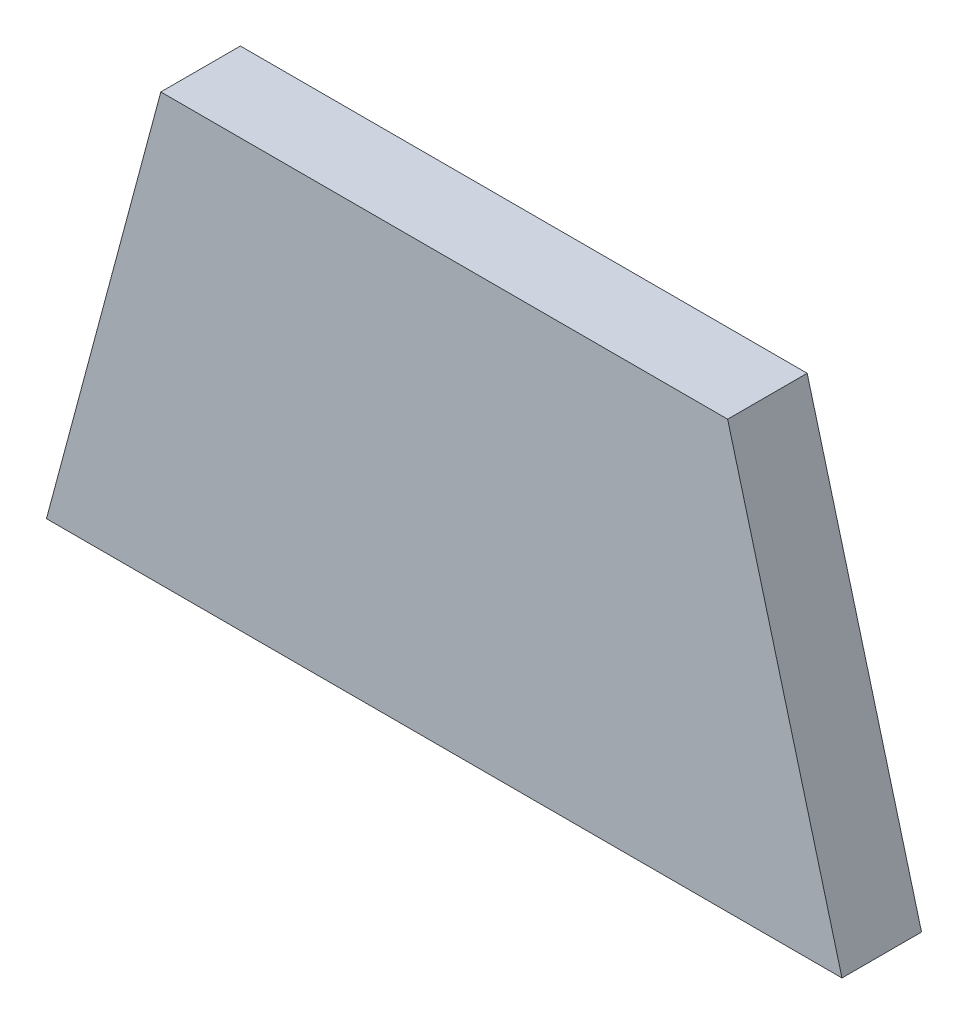
ISO-10303-21;
HEADER;
FILE_DESCRIPTION(('STEP AP214'),'2;1');
FILE_NAME('part.step','',(''),(''),'','','');
FILE_SCHEMA(('AUTOMOTIVE_DESIGN { 1 0 10303 214 1 1 1 1 }'));
ENDSEC;
DATA;
#1=APPLICATION_CONTEXT('core data for automotive mechanical design processes');
#2=APPLICATION_PROTOCOL_DEFINITION('international standard','automotive_design',2000,#1);
#3=PRODUCT_CONTEXT('',#1,'mechanical');
#4=PRODUCT('Part','Part','',(#3));
#5=PRODUCT_RELATED_PRODUCT_CATEGORY('part','',(#4));
#6=PRODUCT_DEFINITION_FORMATION('','',#4);
#7=PRODUCT_DEFINITION_CONTEXT('part definition',#1,'design');
#8=PRODUCT_DEFINITION('design','',#6,#7);
#9=PRODUCT_DEFINITION_SHAPE('','',#8);
#10=(LENGTH_UNIT() NAMED_UNIT(*) SI_UNIT(.MILLI.,.METRE.));
#11=(NAMED_UNIT(*) PLANE_ANGLE_UNIT() SI_UNIT($,.RADIAN.));
#12=(NAMED_UNIT(*) SI_UNIT($,.STERADIAN.) SOLID_ANGLE_UNIT());
#13=UNCERTAINTY_MEASURE_WITH_UNIT(LENGTH_MEASURE(1.E-05),#10,'distance_accuracy_value','');
#14=(GEOMETRIC_REPRESENTATION_CONTEXT(3) GLOBAL_UNCERTAINTY_ASSIGNED_CONTEXT((#13)) GLOBAL_UNIT_ASSIGNED_CONTEXT((#10,
#11,#12)) REPRESENTATION_CONTEXT('',''));
#15=CARTESIAN_POINT('',(0.,0.,0.));
#16=DIRECTION('',(0.,0.,1.));
#17=DIRECTION('',(1.,0.,0.));
#18=AXIS2_PLACEMENT_3D('',#15,#16,#17);
#19=CARTESIAN_POINT('',(-90.4875,136.266505111356,25.4));
#20=DIRECTION('',(0.965925826289067,-0.258819045102525,0.));
#21=DIRECTION('',(0.258819045102525,0.965925826289067,0.));
#22=AXIS2_PLACEMENT_3D('',#19,#20,#21);
#23=PLANE('',#22);
#24=DIRECTION('',(-0.258819045102525,-0.965925826289067,0.));
#25=VECTOR('',#24,1.);
#26=CARTESIAN_POINT('',(-90.4875,136.266505111356,0.));
#27=LINE('',#26,#25);
#28=CARTESIAN_POINT('',(-90.4875,136.266505111356,0.));
#29=VERTEX_POINT('',#28);
#30=CARTESIAN_POINT('',(-127.,0.,0.));
#31=VERTEX_POINT('',#30);
#32=EDGE_CURVE('E60',#29,#31,#27,.T.);
#33=ORIENTED_EDGE('',*,*,#32,.T.);
#34=DIRECTION('',(0.,0.,-1.));
#35=VECTOR('',#34,1.);
#36=CARTESIAN_POINT('',(-127.,0.,25.4));
#37=LINE('',#36,#35);
#38=CARTESIAN_POINT('',(-127.,0.,25.4));
#39=VERTEX_POINT('',#38);
#40=EDGE_CURVE('E11',#39,#31,#37,.T.);
#41=ORIENTED_EDGE('',*,*,#40,.F.);
#42=DIRECTION('',(-0.258819045102525,-0.965925826289067,0.));
#43=VECTOR('',#42,1.);
#44=CARTESIAN_POINT('',(-90.4875,136.266505111356,25.4));
#45=LINE('',#44,#43);
#46=CARTESIAN_POINT('',(-90.4875,136.266505111356,25.4));
#47=VERTEX_POINT('',#46);
#48=EDGE_CURVE('E78',#47,#39,#45,.T.);
#49=ORIENTED_EDGE('',*,*,#48,.F.);
#50=DIRECTION('',(0.,0.,-1.));
#51=VECTOR('',#50,1.);
#52=CARTESIAN_POINT('',(-90.4875,136.266505111356,25.4));
#53=LINE('',#52,#51);
#54=EDGE_CURVE('E72',#47,#29,#53,.T.);
#55=ORIENTED_EDGE('',*,*,#54,.T.);
#56=EDGE_LOOP('',(#33,#41,#49,#55));
#57=FACE_BOUND('',#56,.T.);
#58=ADVANCED_FACE('F16',(#57),#23,.F.);
#59=CARTESIAN_POINT('',(-127.,0.,25.4));
#60=DIRECTION('',(0.,1.,0.));
#61=DIRECTION('',(0.,0.,1.));
#62=AXIS2_PLACEMENT_3D('',#59,#60,#61);
#63=PLANE('',#62);
#64=DIRECTION('',(1.,0.,0.));
#65=VECTOR('',#64,1.);
#66=CARTESIAN_POINT('',(-127.,0.,0.));
#67=LINE('',#66,#65);
#68=CARTESIAN_POINT('',(127.,0.,0.));
#69=VERTEX_POINT('',#68);
#70=EDGE_CURVE('E56',#31,#69,#67,.T.);
#71=ORIENTED_EDGE('',*,*,#70,.T.);
#72=DIRECTION('',(0.,0.,-1.));
#73=VECTOR('',#72,1.);
#74=CARTESIAN_POINT('',(127.,0.,25.4));
#75=LINE('',#74,#73);
#76=CARTESIAN_POINT('',(127.,0.,25.4));
#77=VERTEX_POINT('',#76);
#78=EDGE_CURVE('E23',#77,#69,#75,.T.);
#79=ORIENTED_EDGE('',*,*,#78,.F.);
#80=DIRECTION('',(1.,0.,0.));
#81=VECTOR('',#80,1.);
#82=CARTESIAN_POINT('',(-127.,0.,25.4));
#83=LINE('',#82,#81);
#84=EDGE_CURVE('E68',#39,#77,#83,.T.);
#85=ORIENTED_EDGE('',*,*,#84,.F.);
#86=ORIENTED_EDGE('',*,*,#40,.T.);
#87=EDGE_LOOP('',(#71,#79,#85,#86));
#88=FACE_BOUND('',#87,.T.);
#89=ADVANCED_FACE('F67',(#88),#63,.F.);
#90=CARTESIAN_POINT('',(90.4875,136.266505111356,25.4));
#91=DIRECTION('',(-0.965925826289067,-0.258819045102525,0.));
#92=DIRECTION('',(0.258819045102525,-0.965925826289067,0.));
#93=AXIS2_PLACEMENT_3D('',#90,#91,#92);
#94=PLANE('',#93);
#95=DIRECTION('',(-0.258819045102525,0.965925826289067,0.));
#96=VECTOR('',#95,1.);
#97=CARTESIAN_POINT('',(90.4875,136.266505111356,0.));
#98=LINE('',#97,#96);
#99=CARTESIAN_POINT('',(90.4875,136.266505111356,0.));
#100=VERTEX_POINT('',#99);
#101=EDGE_CURVE('E61',#69,#100,#98,.T.);
#102=ORIENTED_EDGE('',*,*,#101,.T.);
#103=DIRECTION('',(0.,0.,-1.));
#104=VECTOR('',#103,1.);
#105=CARTESIAN_POINT('',(90.4875,136.266505111356,25.4));
#106=LINE('',#105,#104);
#107=CARTESIAN_POINT('',(90.4875,136.266505111356,25.4));
#108=VERTEX_POINT('',#107);
#109=EDGE_CURVE('E84',#108,#100,#106,.T.);
#110=ORIENTED_EDGE('',*,*,#109,.F.);
#111=DIRECTION('',(-0.258819045102525,0.965925826289067,0.));
#112=VECTOR('',#111,1.);
#113=CARTESIAN_POINT('',(90.4875,136.266505111356,25.4));
#114=LINE('',#113,#112);
#115=EDGE_CURVE('E35',#77,#108,#114,.T.);
#116=ORIENTED_EDGE('',*,*,#115,.F.);
#117=ORIENTED_EDGE('',*,*,#78,.T.);
#118=EDGE_LOOP('',(#102,#110,#116,#117));
#119=FACE_BOUND('',#118,.T.);
#120=ADVANCED_FACE('F87',(#119),#94,.F.);
#121=CARTESIAN_POINT('',(90.4875,136.266505111356,25.4));
#122=DIRECTION('',(0.,-1.,0.));
#123=DIRECTION('',(0.,0.,-1.));
#124=AXIS2_PLACEMENT_3D('',#121,#122,#123);
#125=PLANE('',#124);
#126=DIRECTION('',(-1.,0.,0.));
#127=VECTOR('',#126,1.);
#128=CARTESIAN_POINT('',(90.4875,136.266505111356,0.));
#129=LINE('',#128,#127);
#130=EDGE_CURVE('E76',#100,#29,#129,.T.);
#131=ORIENTED_EDGE('',*,*,#130,.T.);
#132=ORIENTED_EDGE('',*,*,#54,.F.);
#133=DIRECTION('',(-1.,0.,0.));
#134=VECTOR('',#133,1.);
#135=CARTESIAN_POINT('',(90.4875,136.266505111356,25.4));
#136=LINE('',#135,#134);
#137=EDGE_CURVE('E30',#108,#47,#136,.T.);
#138=ORIENTED_EDGE('',*,*,#137,.F.);
#139=ORIENTED_EDGE('',*,*,#109,.T.);
#140=EDGE_LOOP('',(#131,#132,#138,#139));
#141=FACE_BOUND('',#140,.T.);
#142=ADVANCED_FACE('F89',(#141),#125,.F.);
#143=CARTESIAN_POINT('',(-127.,0.,25.4));
#144=DIRECTION('',(0.,0.,1.));
#145=DIRECTION('',(1.,0.,0.));
#146=AXIS2_PLACEMENT_3D('',#143,#144,#145);
#147=PLANE('',#146);
#148=ORIENTED_EDGE('',*,*,#48,.T.);
#149=ORIENTED_EDGE('',*,*,#84,.T.);
#150=ORIENTED_EDGE('',*,*,#115,.T.);
#151=ORIENTED_EDGE('',*,*,#137,.T.);
#152=EDGE_LOOP('',(#148,#149,#150,#151));
#153=FACE_BOUND('',#152,.T.);
#154=ADVANCED_FACE('F90',(#153),#147,.T.);
#155=CARTESIAN_POINT('',(-127.,0.,0.));
#156=DIRECTION('',(0.,0.,1.));
#157=DIRECTION('',(1.,0.,0.));
#158=AXIS2_PLACEMENT_3D('',#155,#156,#157);
#159=PLANE('',#158);
#160=ORIENTED_EDGE('',*,*,#32,.F.);
#161=ORIENTED_EDGE('',*,*,#130,.F.);
#162=ORIENTED_EDGE('',*,*,#101,.F.);
#163=ORIENTED_EDGE('',*,*,#70,.F.);
#164=EDGE_LOOP('',(#160,#161,#162,#163));
#165=FACE_BOUND('',#164,.T.);
#166=ADVANCED_FACE('F57',(#165),#159,.F.);
#167=CLOSED_SHELL('',(#58,#89,#120,#142,#154,#166));
#168=MANIFOLD_SOLID_BREP('B1',#167);
#169=ADVANCED_BREP_SHAPE_REPRESENTATION('',(#18,#168),#14);
#170=SHAPE_DEFINITION_REPRESENTATION(#9,#169);
ENDSEC;
END-ISO-10303-21;
